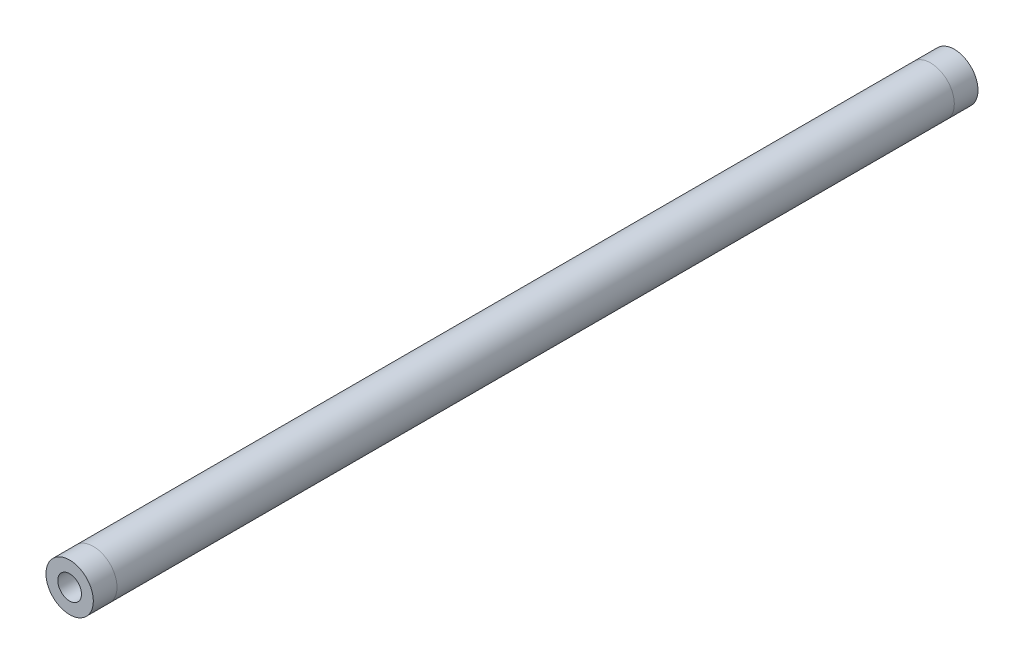
ISO-10303-21;
HEADER;
FILE_DESCRIPTION(('STEP AP214'),'2;1');
FILE_NAME('part.step','',(''),(''),'','','');
FILE_SCHEMA(('AUTOMOTIVE_DESIGN { 1 0 10303 214 1 1 1 1 }'));
ENDSEC;
DATA;
#1=APPLICATION_CONTEXT('core data for automotive mechanical design processes');
#2=APPLICATION_PROTOCOL_DEFINITION('international standard','automotive_design',2000,#1);
#3=PRODUCT_CONTEXT('',#1,'mechanical');
#4=PRODUCT('Part','Part','',(#3));
#5=PRODUCT_RELATED_PRODUCT_CATEGORY('part','',(#4));
#6=PRODUCT_DEFINITION_FORMATION('','',#4);
#7=PRODUCT_DEFINITION_CONTEXT('part definition',#1,'design');
#8=PRODUCT_DEFINITION('design','',#6,#7);
#9=PRODUCT_DEFINITION_SHAPE('','',#8);
#10=(LENGTH_UNIT() NAMED_UNIT(*) SI_UNIT(.MILLI.,.METRE.));
#11=(NAMED_UNIT(*) PLANE_ANGLE_UNIT() SI_UNIT($,.RADIAN.));
#12=(NAMED_UNIT(*) SI_UNIT($,.STERADIAN.) SOLID_ANGLE_UNIT());
#13=UNCERTAINTY_MEASURE_WITH_UNIT(LENGTH_MEASURE(1.E-05),#10,'distance_accuracy_value','');
#14=(GEOMETRIC_REPRESENTATION_CONTEXT(3) GLOBAL_UNCERTAINTY_ASSIGNED_CONTEXT((#13)) GLOBAL_UNIT_ASSIGNED_CONTEXT((#10,
#11,#12)) REPRESENTATION_CONTEXT('',''));
#15=CARTESIAN_POINT('',(0.,0.,0.));
#16=DIRECTION('',(0.,0.,1.));
#17=DIRECTION('',(1.,0.,0.));
#18=AXIS2_PLACEMENT_3D('',#15,#16,#17);
#19=CARTESIAN_POINT('',(0.,0.,-237.205621600147));
#20=DIRECTION('',(0.,0.,1.));
#21=DIRECTION('',(1.,0.,0.));
#22=AXIS2_PLACEMENT_3D('',#19,#20,#21);
#23=CYLINDRICAL_SURFACE('',#22,6.35);
#24=CARTESIAN_POINT('',(0.,0.,-237.205621600147));
#25=DIRECTION('',(0.,0.,1.));
#26=DIRECTION('',(1.,0.,0.));
#27=AXIS2_PLACEMENT_3D('',#24,#25,#26);
#28=CIRCLE('',#27,6.35);
#29=CARTESIAN_POINT('',(6.35,0.,-237.205621600147));
#30=VERTEX_POINT('',#29);
#31=EDGE_CURVE('E87',#30,#30,#28,.T.);
#32=ORIENTED_EDGE('',*,*,#31,.T.);
#33=EDGE_LOOP('',(#32));
#34=FACE_BOUND('',#33,.T.);
#35=CARTESIAN_POINT('',(0.,0.,-230.855621600147));
#36=DIRECTION('',(0.,0.,1.));
#37=DIRECTION('',(1.,0.,0.));
#38=AXIS2_PLACEMENT_3D('',#35,#36,#37);
#39=CIRCLE('',#38,6.35);
#40=CARTESIAN_POINT('',(6.35,0.,-230.855621600147));
#41=VERTEX_POINT('',#40);
#42=EDGE_CURVE('E83',#41,#41,#39,.T.);
#43=ORIENTED_EDGE('',*,*,#42,.F.);
#44=EDGE_LOOP('',(#43));
#45=FACE_BOUND('',#44,.T.);
#46=ADVANCED_FACE('F80',(#34,#45),#23,.T.);
#47=CARTESIAN_POINT('',(0.,0.,-237.205621600147));
#48=DIRECTION('',(0.,0.,1.));
#49=DIRECTION('',(1.,0.,0.));
#50=AXIS2_PLACEMENT_3D('',#47,#48,#49);
#51=PLANE('',#50);
#52=CARTESIAN_POINT('',(0.,0.,-237.205621600147));
#53=DIRECTION('',(0.,0.,1.));
#54=DIRECTION('',(1.,0.,0.));
#55=AXIS2_PLACEMENT_3D('',#52,#53,#54);
#56=CIRCLE('',#55,3.175);
#57=CARTESIAN_POINT('',(3.175,0.,-237.205621600147));
#58=VERTEX_POINT('',#57);
#59=EDGE_CURVE('E96',#58,#58,#56,.T.);
#60=ORIENTED_EDGE('',*,*,#59,.T.);
#61=EDGE_LOOP('',(#60));
#62=FACE_BOUND('',#61,.T.);
#63=ORIENTED_EDGE('',*,*,#31,.F.);
#64=EDGE_LOOP('',(#63));
#65=FACE_BOUND('',#64,.T.);
#66=ADVANCED_FACE('F123',(#62,#65),#51,.F.);
#67=CARTESIAN_POINT('',(0.,0.,-230.855621600147));
#68=DIRECTION('',(0.,0.,1.));
#69=DIRECTION('',(1.,0.,0.));
#70=AXIS2_PLACEMENT_3D('',#67,#68,#69);
#71=PLANE('',#70);
#72=CARTESIAN_POINT('',(0.,0.,-230.855621600147));
#73=DIRECTION('',(0.,0.,1.));
#74=DIRECTION('',(1.,0.,0.));
#75=AXIS2_PLACEMENT_3D('',#72,#73,#74);
#76=CIRCLE('',#75,4.8768);
#77=CARTESIAN_POINT('',(-4.8768,0.,-230.855621600147));
#78=VERTEX_POINT('',#77);
#79=EDGE_CURVE('E12',#78,#78,#76,.T.);
#80=ORIENTED_EDGE('',*,*,#79,.F.);
#81=EDGE_LOOP('',(#80));
#82=FACE_BOUND('',#81,.T.);
#83=ORIENTED_EDGE('',*,*,#42,.T.);
#84=EDGE_LOOP('',(#83));
#85=FACE_BOUND('',#84,.T.);
#86=ADVANCED_FACE('F119',(#82,#85),#71,.T.);
#87=CARTESIAN_POINT('',(0.,0.,-237.205621600147));
#88=DIRECTION('',(0.,0.,1.));
#89=DIRECTION('',(1.,0.,0.));
#90=AXIS2_PLACEMENT_3D('',#87,#88,#89);
#91=CYLINDRICAL_SURFACE('',#90,3.175);
#92=ORIENTED_EDGE('',*,*,#59,.F.);
#93=EDGE_LOOP('',(#92));
#94=FACE_BOUND('',#93,.T.);
#95=CARTESIAN_POINT('',(0.,0.,-221.330621600147));
#96=DIRECTION('',(0.,0.,1.));
#97=DIRECTION('',(1.,0.,0.));
#98=AXIS2_PLACEMENT_3D('',#95,#96,#97);
#99=CIRCLE('',#98,3.175);
#100=CARTESIAN_POINT('',(3.175,0.,-221.330621600147));
#101=VERTEX_POINT('',#100);
#102=EDGE_CURVE('E102',#101,#101,#99,.T.);
#103=ORIENTED_EDGE('',*,*,#102,.T.);
#104=EDGE_LOOP('',(#103));
#105=FACE_BOUND('',#104,.T.);
#106=ADVANCED_FACE('F108',(#94,#105),#91,.F.);
#107=CARTESIAN_POINT('',(0.,0.,-221.330621600147));
#108=DIRECTION('',(0.,0.,1.));
#109=DIRECTION('',(1.,0.,0.));
#110=AXIS2_PLACEMENT_3D('',#107,#108,#109);
#111=PLANE('',#110);
#112=CARTESIAN_POINT('',(0.,0.,-221.330621600147));
#113=DIRECTION('',(0.,0.,1.));
#114=DIRECTION('',(1.,0.,0.));
#115=AXIS2_PLACEMENT_3D('',#112,#113,#114);
#116=CIRCLE('',#115,4.8768);
#117=CARTESIAN_POINT('',(-4.8768,0.,-221.330621600147));
#118=VERTEX_POINT('',#117);
#119=EDGE_CURVE('E94',#118,#118,#116,.T.);
#120=ORIENTED_EDGE('',*,*,#119,.T.);
#121=EDGE_LOOP('',(#120));
#122=FACE_BOUND('',#121,.T.);
#123=ORIENTED_EDGE('',*,*,#102,.F.);
#124=EDGE_LOOP('',(#123));
#125=FACE_BOUND('',#124,.T.);
#126=ADVANCED_FACE('F110',(#122,#125),#111,.T.);
#127=CARTESIAN_POINT('',(0.,0.,-221.330621600147));
#128=DIRECTION('',(0.,0.,-1.));
#129=DIRECTION('',(-1.,0.,0.));
#130=AXIS2_PLACEMENT_3D('',#127,#128,#129);
#131=CYLINDRICAL_SURFACE('',#130,4.8768);
#132=CARTESIAN_POINT('',(-4.8768,0.,-221.330621600147));
#133=CARTESIAN_POINT('',(-4.8768,0.,-221.429840350147));
#134=CARTESIAN_POINT('',(-4.8768,0.,-221.529059100147));
#135=CARTESIAN_POINT('',(-4.8768,0.,-221.727496600147));
#136=CARTESIAN_POINT('',(-4.8768,0.,-221.826715350147));
#137=CARTESIAN_POINT('',(-4.8768,0.,-222.025152850147));
#138=CARTESIAN_POINT('',(-4.8768,0.,-222.124371600147));
#139=CARTESIAN_POINT('',(-4.8768,0.,-222.322809100147));
#140=CARTESIAN_POINT('',(-4.8768,0.,-222.422027850147));
#141=CARTESIAN_POINT('',(-4.8768,0.,-222.620465350147));
#142=CARTESIAN_POINT('',(-4.8768,0.,-222.719684100147));
#143=CARTESIAN_POINT('',(-4.8768,0.,-222.918121600147));
#144=CARTESIAN_POINT('',(-4.8768,0.,-223.017340350147));
#145=CARTESIAN_POINT('',(-4.8768,0.,-223.215777850147));
#146=CARTESIAN_POINT('',(-4.8768,0.,-223.314996600147));
#147=CARTESIAN_POINT('',(-4.8768,0.,-223.513434100147));
#148=CARTESIAN_POINT('',(-4.8768,0.,-223.612652850147));
#149=CARTESIAN_POINT('',(-4.8768,0.,-223.811090350147));
#150=CARTESIAN_POINT('',(-4.8768,0.,-223.910309100147));
#151=CARTESIAN_POINT('',(-4.8768,0.,-224.108746600147));
#152=CARTESIAN_POINT('',(-4.8768,0.,-224.207965350147));
#153=CARTESIAN_POINT('',(-4.8768,0.,-224.406402850147));
#154=CARTESIAN_POINT('',(-4.8768,0.,-224.505621600147));
#155=CARTESIAN_POINT('',(-4.8768,0.,-224.704059100147));
#156=CARTESIAN_POINT('',(-4.8768,0.,-224.803277850147));
#157=CARTESIAN_POINT('',(-4.8768,0.,-225.001715350147));
#158=CARTESIAN_POINT('',(-4.8768,0.,-225.100934100147));
#159=CARTESIAN_POINT('',(-4.8768,0.,-225.299371600147));
#160=CARTESIAN_POINT('',(-4.8768,0.,-225.398590350147));
#161=CARTESIAN_POINT('',(-4.8768,0.,-225.597027850147));
#162=CARTESIAN_POINT('',(-4.8768,0.,-225.696246600147));
#163=CARTESIAN_POINT('',(-4.8768,0.,-225.894684100147));
#164=CARTESIAN_POINT('',(-4.8768,0.,-225.993902850147));
#165=CARTESIAN_POINT('',(-4.8768,0.,-226.192340350147));
#166=CARTESIAN_POINT('',(-4.8768,0.,-226.291559100147));
#167=CARTESIAN_POINT('',(-4.8768,0.,-226.489996600147));
#168=CARTESIAN_POINT('',(-4.8768,0.,-226.589215350147));
#169=CARTESIAN_POINT('',(-4.8768,0.,-226.787652850147));
#170=CARTESIAN_POINT('',(-4.8768,0.,-226.886871600147));
#171=CARTESIAN_POINT('',(-4.8768,0.,-227.085309100147));
#172=CARTESIAN_POINT('',(-4.8768,0.,-227.184527850147));
#173=CARTESIAN_POINT('',(-4.8768,0.,-227.382965350147));
#174=CARTESIAN_POINT('',(-4.8768,0.,-227.482184100147));
#175=CARTESIAN_POINT('',(-4.8768,0.,-227.680621600147));
#176=CARTESIAN_POINT('',(-4.8768,0.,-227.779840350147));
#177=CARTESIAN_POINT('',(-4.8768,0.,-227.978277850147));
#178=CARTESIAN_POINT('',(-4.8768,0.,-228.077496600147));
#179=CARTESIAN_POINT('',(-4.8768,0.,-228.275934100147));
#180=CARTESIAN_POINT('',(-4.8768,0.,-228.375152850147));
#181=CARTESIAN_POINT('',(-4.8768,0.,-228.573590350147));
#182=CARTESIAN_POINT('',(-4.8768,0.,-228.672809100147));
#183=CARTESIAN_POINT('',(-4.8768,0.,-228.871246600147));
#184=CARTESIAN_POINT('',(-4.8768,0.,-228.970465350147));
#185=CARTESIAN_POINT('',(-4.8768,0.,-229.168902850147));
#186=CARTESIAN_POINT('',(-4.8768,0.,-229.268121600147));
#187=CARTESIAN_POINT('',(-4.8768,0.,-229.466559100147));
#188=CARTESIAN_POINT('',(-4.8768,0.,-229.565777850147));
#189=CARTESIAN_POINT('',(-4.8768,0.,-229.764215350147));
#190=CARTESIAN_POINT('',(-4.8768,0.,-229.863434100147));
#191=CARTESIAN_POINT('',(-4.8768,0.,-230.061871600147));
#192=CARTESIAN_POINT('',(-4.8768,0.,-230.161090350147));
#193=CARTESIAN_POINT('',(-4.8768,0.,-230.359527850147));
#194=CARTESIAN_POINT('',(-4.8768,0.,-230.458746600147));
#195=CARTESIAN_POINT('',(-4.8768,0.,-230.657184100147));
#196=CARTESIAN_POINT('',(-4.8768,0.,-230.756402850147));
#197=CARTESIAN_POINT('',(-4.8768,0.,-230.855621600147));
#198=B_SPLINE_CURVE_WITH_KNOTS('',3,(#132,#133,#134,#135,#136,#137,#138,#139,#140,#141,#142,
#143,#144,#145,#146,#147,#148,#149,#150,#151,#152,#153,#154,#155,#156,#157,#158,#159,#160,#161,
#162,#163,#164,#165,#166,#167,#168,#169,#170,#171,#172,#173,#174,#175,#176,#177,#178,#179,#180,
#181,#182,#183,#184,#185,#186,#187,#188,#189,#190,#191,#192,#193,#194,#195,#196,#197),
.UNSPECIFIED.,.F.,.F.,(4,2,2,2,2,2,2,2,2,2,2,2,2,2,2,2,2,2,2,2,2,2,2,2,2,2,2,2,2,2,2,2,4),(0.,
0.29765625,0.5953125,0.892968750000001,1.190625,1.48828125,1.7859375,2.08359375,2.38125,
2.67890625,2.9765625,3.27421875,3.571875,3.86953125,4.1671875,4.46484375,4.7625,5.06015625,
5.3578125,5.65546875,5.953125,6.25078125,6.5484375,6.84609375,7.14375,7.44140625,7.7390625,
8.03671875000001,8.334375,8.63203125,8.92968750000001,9.22734375000001,9.52500000000001),.UNSPECIFIED.);
#199=EDGE_CURVE('BSEAM112',#118,#78,#198,.T.);
#200=ORIENTED_EDGE('',*,*,#119,.F.);
#201=ORIENTED_EDGE('',*,*,#79,.T.);
#202=ORIENTED_EDGE('',*,*,#199,.T.);
#203=ORIENTED_EDGE('',*,*,#199,.F.);
#204=EDGE_LOOP('',(#200,#202,#201,#203));
#205=FACE_BOUND('',#204,.T.);
#206=ADVANCED_FACE('F112',(#205),#131,.T.);
#207=CLOSED_SHELL('',(#46,#66,#86,#106,#126,#206));
#208=MANIFOLD_SOLID_BREP('B2',#207);
#209=CARTESIAN_POINT('',(0.,0.,-230.855621600147));
#210=DIRECTION('',(0.,0.,1.));
#211=DIRECTION('',(1.,0.,0.));
#212=AXIS2_PLACEMENT_3D('',#209,#210,#211);
#213=CYLINDRICAL_SURFACE('',#212,6.35);
#214=CARTESIAN_POINT('',(0.,0.,-230.855621600147));
#215=DIRECTION('',(0.,0.,1.));
#216=DIRECTION('',(1.,0.,0.));
#217=AXIS2_PLACEMENT_3D('',#214,#215,#216);
#218=CIRCLE('',#217,6.35);
#219=CARTESIAN_POINT('',(6.35,0.,-230.855621600147));
#220=VERTEX_POINT('',#219);
#221=EDGE_CURVE('E79',#220,#220,#218,.T.);
#222=ORIENTED_EDGE('',*,*,#221,.T.);
#223=EDGE_LOOP('',(#222));
#224=FACE_BOUND('',#223,.T.);
#225=CARTESIAN_POINT('',(0.,0.,-6.35));
#226=DIRECTION('',(0.,0.,1.));
#227=DIRECTION('',(1.,0.,0.));
#228=AXIS2_PLACEMENT_3D('',#225,#226,#227);
#229=CIRCLE('',#228,6.35);
#230=CARTESIAN_POINT('',(6.35,0.,-6.35));
#231=VERTEX_POINT('',#230);
#232=EDGE_CURVE('E195',#231,#231,#229,.T.);
#233=ORIENTED_EDGE('',*,*,#232,.F.);
#234=EDGE_LOOP('',(#233));
#235=FACE_BOUND('',#234,.T.);
#236=ADVANCED_FACE('F192',(#224,#235),#213,.T.);
#237=CARTESIAN_POINT('',(0.,0.,-230.855621600147));
#238=DIRECTION('',(0.,0.,1.));
#239=DIRECTION('',(1.,0.,0.));
#240=AXIS2_PLACEMENT_3D('',#237,#238,#239);
#241=PLANE('',#240);
#242=CARTESIAN_POINT('',(0.,0.,-230.855621600147));
#243=DIRECTION('',(0.,0.,1.));
#244=DIRECTION('',(1.,0.,0.));
#245=AXIS2_PLACEMENT_3D('',#242,#243,#244);
#246=CIRCLE('',#245,4.8768);
#247=CARTESIAN_POINT('',(4.8768,0.,-230.855621600147));
#248=VERTEX_POINT('',#247);
#249=EDGE_CURVE('E204',#248,#248,#246,.T.);
#250=ORIENTED_EDGE('',*,*,#249,.T.);
#251=EDGE_LOOP('',(#250));
#252=FACE_BOUND('',#251,.T.);
#253=ORIENTED_EDGE('',*,*,#221,.F.);
#254=EDGE_LOOP('',(#253));
#255=FACE_BOUND('',#254,.T.);
#256=ADVANCED_FACE('F214',(#252,#255),#241,.F.);
#257=CARTESIAN_POINT('',(0.,0.,-6.35));
#258=DIRECTION('',(0.,0.,1.));
#259=DIRECTION('',(1.,0.,0.));
#260=AXIS2_PLACEMENT_3D('',#257,#258,#259);
#261=PLANE('',#260);
#262=CARTESIAN_POINT('',(0.,0.,-6.35));
#263=DIRECTION('',(0.,0.,1.));
#264=DIRECTION('',(1.,0.,0.));
#265=AXIS2_PLACEMENT_3D('',#262,#263,#264);
#266=CIRCLE('',#265,4.8768);
#267=CARTESIAN_POINT('',(4.8768,0.,-6.35));
#268=VERTEX_POINT('',#267);
#269=EDGE_CURVE('E206',#268,#268,#266,.T.);
#270=ORIENTED_EDGE('',*,*,#269,.F.);
#271=EDGE_LOOP('',(#270));
#272=FACE_BOUND('',#271,.T.);
#273=ORIENTED_EDGE('',*,*,#232,.T.);
#274=EDGE_LOOP('',(#273));
#275=FACE_BOUND('',#274,.T.);
#276=ADVANCED_FACE('F220',(#272,#275),#261,.T.);
#277=CARTESIAN_POINT('',(0.,0.,-230.855621600147));
#278=DIRECTION('',(0.,0.,1.));
#279=DIRECTION('',(1.,0.,0.));
#280=AXIS2_PLACEMENT_3D('',#277,#278,#279);
#281=CYLINDRICAL_SURFACE('',#280,4.8768);
#282=ORIENTED_EDGE('',*,*,#249,.F.);
#283=EDGE_LOOP('',(#282));
#284=FACE_BOUND('',#283,.T.);
#285=ORIENTED_EDGE('',*,*,#269,.T.);
#286=EDGE_LOOP('',(#285));
#287=FACE_BOUND('',#286,.T.);
#288=ADVANCED_FACE('F217',(#284,#287),#281,.F.);
#289=CLOSED_SHELL('',(#236,#256,#276,#288));
#290=MANIFOLD_SOLID_BREP('B7',#289);
#291=CARTESIAN_POINT('',(0.,0.,-6.35));
#292=DIRECTION('',(0.,0.,1.));
#293=DIRECTION('',(1.,0.,0.));
#294=AXIS2_PLACEMENT_3D('',#291,#292,#293);
#295=CYLINDRICAL_SURFACE('',#294,6.35);
#296=CARTESIAN_POINT('',(0.,0.,-6.35));
#297=DIRECTION('',(0.,0.,1.));
#298=DIRECTION('',(1.,0.,0.));
#299=AXIS2_PLACEMENT_3D('',#296,#297,#298);
#300=CIRCLE('',#299,6.35);
#301=CARTESIAN_POINT('',(6.35,0.,-6.35));
#302=VERTEX_POINT('',#301);
#303=EDGE_CURVE('E191',#302,#302,#300,.T.);
#304=ORIENTED_EDGE('',*,*,#303,.T.);
#305=EDGE_LOOP('',(#304));
#306=FACE_BOUND('',#305,.T.);
#307=CARTESIAN_POINT('',(0.,0.,0.));
#308=DIRECTION('',(0.,0.,1.));
#309=DIRECTION('',(1.,0.,0.));
#310=AXIS2_PLACEMENT_3D('',#307,#308,#309);
#311=CIRCLE('',#310,6.35);
#312=CARTESIAN_POINT('',(6.35,0.,0.));
#313=VERTEX_POINT('',#312);
#314=EDGE_CURVE('E269',#313,#313,#311,.T.);
#315=ORIENTED_EDGE('',*,*,#314,.F.);
#316=EDGE_LOOP('',(#315));
#317=FACE_BOUND('',#316,.T.);
#318=ADVANCED_FACE('F258',(#306,#317),#295,.T.);
#319=CARTESIAN_POINT('',(0.,0.,-6.35));
#320=DIRECTION('',(0.,0.,1.));
#321=DIRECTION('',(1.,0.,0.));
#322=AXIS2_PLACEMENT_3D('',#319,#320,#321);
#323=CYLINDRICAL_SURFACE('',#322,3.175);
#324=CARTESIAN_POINT('',(0.,0.,0.));
#325=DIRECTION('',(0.,0.,1.));
#326=DIRECTION('',(1.,0.,0.));
#327=AXIS2_PLACEMENT_3D('',#324,#325,#326);
#328=CIRCLE('',#327,3.175);
#329=CARTESIAN_POINT('',(3.175,0.,0.));
#330=VERTEX_POINT('',#329);
#331=EDGE_CURVE('E261',#330,#330,#328,.T.);
#332=ORIENTED_EDGE('',*,*,#331,.T.);
#333=EDGE_LOOP('',(#332));
#334=FACE_BOUND('',#333,.T.);
#335=CARTESIAN_POINT('',(0.,0.,-15.875));
#336=DIRECTION('',(0.,0.,1.));
#337=DIRECTION('',(1.,0.,0.));
#338=AXIS2_PLACEMENT_3D('',#335,#336,#337);
#339=CIRCLE('',#338,3.175);
#340=CARTESIAN_POINT('',(3.175,0.,-15.875));
#341=VERTEX_POINT('',#340);
#342=EDGE_CURVE('E281',#341,#341,#339,.T.);
#343=ORIENTED_EDGE('',*,*,#342,.F.);
#344=EDGE_LOOP('',(#343));
#345=FACE_BOUND('',#344,.T.);
#346=ADVANCED_FACE('F289',(#334,#345),#323,.F.);
#347=CARTESIAN_POINT('',(0.,0.,-6.35));
#348=DIRECTION('',(0.,0.,1.));
#349=DIRECTION('',(1.,0.,0.));
#350=AXIS2_PLACEMENT_3D('',#347,#348,#349);
#351=PLANE('',#350);
#352=CARTESIAN_POINT('',(0.,0.,-6.35));
#353=DIRECTION('',(0.,0.,1.));
#354=DIRECTION('',(1.,0.,0.));
#355=AXIS2_PLACEMENT_3D('',#352,#353,#354);
#356=CIRCLE('',#355,4.8768);
#357=CARTESIAN_POINT('',(4.8768,0.,-6.35));
#358=VERTEX_POINT('',#357);
#359=EDGE_CURVE('E271',#358,#358,#356,.T.);
#360=ORIENTED_EDGE('',*,*,#359,.T.);
#361=EDGE_LOOP('',(#360));
#362=FACE_BOUND('',#361,.T.);
#363=ORIENTED_EDGE('',*,*,#303,.F.);
#364=EDGE_LOOP('',(#363));
#365=FACE_BOUND('',#364,.T.);
#366=ADVANCED_FACE('F291',(#362,#365),#351,.F.);
#367=CARTESIAN_POINT('',(0.,0.,0.));
#368=DIRECTION('',(0.,0.,1.));
#369=DIRECTION('',(1.,0.,0.));
#370=AXIS2_PLACEMENT_3D('',#367,#368,#369);
#371=PLANE('',#370);
#372=ORIENTED_EDGE('',*,*,#314,.T.);
#373=EDGE_LOOP('',(#372));
#374=FACE_BOUND('',#373,.T.);
#375=ORIENTED_EDGE('',*,*,#331,.F.);
#376=EDGE_LOOP('',(#375));
#377=FACE_BOUND('',#376,.T.);
#378=ADVANCED_FACE('F297',(#374,#377),#371,.T.);
#379=CARTESIAN_POINT('',(0.,0.,-15.875));
#380=DIRECTION('',(0.,0.,1.));
#381=DIRECTION('',(1.,0.,0.));
#382=AXIS2_PLACEMENT_3D('',#379,#380,#381);
#383=CYLINDRICAL_SURFACE('',#382,4.8768);
#384=CARTESIAN_POINT('',(0.,0.,-15.875));
#385=DIRECTION('',(0.,0.,1.));
#386=DIRECTION('',(1.,0.,0.));
#387=AXIS2_PLACEMENT_3D('',#384,#385,#386);
#388=CIRCLE('',#387,4.8768);
#389=CARTESIAN_POINT('',(4.8768,0.,-15.875));
#390=VERTEX_POINT('',#389);
#391=EDGE_CURVE('E274',#390,#390,#388,.T.);
#392=CARTESIAN_POINT('',(4.8768,0.,-15.875));
#393=CARTESIAN_POINT('',(4.8768,0.,-15.77578125));
#394=CARTESIAN_POINT('',(4.8768,0.,-15.6765625));
#395=CARTESIAN_POINT('',(4.8768,0.,-15.478125));
#396=CARTESIAN_POINT('',(4.8768,0.,-15.37890625));
#397=CARTESIAN_POINT('',(4.8768,0.,-15.18046875));
#398=CARTESIAN_POINT('',(4.8768,0.,-15.08125));
#399=CARTESIAN_POINT('',(4.8768,0.,-14.8828125));
#400=CARTESIAN_POINT('',(4.8768,0.,-14.78359375));
#401=CARTESIAN_POINT('',(4.8768,0.,-14.58515625));
#402=CARTESIAN_POINT('',(4.8768,0.,-14.4859375));
#403=CARTESIAN_POINT('',(4.8768,0.,-14.2875));
#404=CARTESIAN_POINT('',(4.8768,0.,-14.18828125));
#405=CARTESIAN_POINT('',(4.8768,0.,-13.98984375));
#406=CARTESIAN_POINT('',(4.8768,0.,-13.890625));
#407=CARTESIAN_POINT('',(4.8768,0.,-13.6921875));
#408=CARTESIAN_POINT('',(4.8768,0.,-13.59296875));
#409=CARTESIAN_POINT('',(4.8768,0.,-13.39453125));
#410=CARTESIAN_POINT('',(4.8768,0.,-13.2953125));
#411=CARTESIAN_POINT('',(4.8768,0.,-13.096875));
#412=CARTESIAN_POINT('',(4.8768,0.,-12.99765625));
#413=CARTESIAN_POINT('',(4.8768,0.,-12.79921875));
#414=CARTESIAN_POINT('',(4.8768,0.,-12.7));
#415=CARTESIAN_POINT('',(4.8768,0.,-12.5015625));
#416=CARTESIAN_POINT('',(4.8768,0.,-12.40234375));
#417=CARTESIAN_POINT('',(4.8768,0.,-12.20390625));
#418=CARTESIAN_POINT('',(4.8768,0.,-12.1046875));
#419=CARTESIAN_POINT('',(4.8768,0.,-11.90625));
#420=CARTESIAN_POINT('',(4.8768,0.,-11.80703125));
#421=CARTESIAN_POINT('',(4.8768,0.,-11.60859375));
#422=CARTESIAN_POINT('',(4.8768,0.,-11.509375));
#423=CARTESIAN_POINT('',(4.8768,0.,-11.3109375));
#424=CARTESIAN_POINT('',(4.8768,0.,-11.21171875));
#425=CARTESIAN_POINT('',(4.8768,0.,-11.01328125));
#426=CARTESIAN_POINT('',(4.8768,0.,-10.9140625));
#427=CARTESIAN_POINT('',(4.8768,0.,-10.715625));
#428=CARTESIAN_POINT('',(4.8768,0.,-10.61640625));
#429=CARTESIAN_POINT('',(4.8768,0.,-10.41796875));
#430=CARTESIAN_POINT('',(4.8768,0.,-10.31875));
#431=CARTESIAN_POINT('',(4.8768,0.,-10.1203125));
#432=CARTESIAN_POINT('',(4.8768,0.,-10.02109375));
#433=CARTESIAN_POINT('',(4.8768,0.,-9.82265625));
#434=CARTESIAN_POINT('',(4.8768,0.,-9.7234375));
#435=CARTESIAN_POINT('',(4.8768,0.,-9.525));
#436=CARTESIAN_POINT('',(4.8768,0.,-9.42578125));
#437=CARTESIAN_POINT('',(4.8768,0.,-9.22734375));
#438=CARTESIAN_POINT('',(4.8768,0.,-9.128125));
#439=CARTESIAN_POINT('',(4.8768,0.,-8.9296875));
#440=CARTESIAN_POINT('',(4.8768,0.,-8.83046875));
#441=CARTESIAN_POINT('',(4.8768,0.,-8.63203125));
#442=CARTESIAN_POINT('',(4.8768,0.,-8.5328125));
#443=CARTESIAN_POINT('',(4.8768,0.,-8.334375));
#444=CARTESIAN_POINT('',(4.8768,0.,-8.23515625));
#445=CARTESIAN_POINT('',(4.8768,0.,-8.03671875));
#446=CARTESIAN_POINT('',(4.8768,0.,-7.9375));
#447=CARTESIAN_POINT('',(4.8768,0.,-7.7390625));
#448=CARTESIAN_POINT('',(4.8768,0.,-7.63984375));
#449=CARTESIAN_POINT('',(4.8768,0.,-7.44140625));
#450=CARTESIAN_POINT('',(4.8768,0.,-7.3421875));
#451=CARTESIAN_POINT('',(4.8768,0.,-7.14375));
#452=CARTESIAN_POINT('',(4.8768,0.,-7.04453125));
#453=CARTESIAN_POINT('',(4.8768,0.,-6.84609375));
#454=CARTESIAN_POINT('',(4.8768,0.,-6.746875));
#455=CARTESIAN_POINT('',(4.8768,0.,-6.5484375));
#456=CARTESIAN_POINT('',(4.8768,0.,-6.44921875));
#457=CARTESIAN_POINT('',(4.8768,0.,-6.35));
#458=B_SPLINE_CURVE_WITH_KNOTS('',3,(#392,#393,#394,#395,#396,#397,#398,#399,#400,#401,#402,
#403,#404,#405,#406,#407,#408,#409,#410,#411,#412,#413,#414,#415,#416,#417,#418,#419,#420,#421,
#422,#423,#424,#425,#426,#427,#428,#429,#430,#431,#432,#433,#434,#435,#436,#437,#438,#439,#440,
#441,#442,#443,#444,#445,#446,#447,#448,#449,#450,#451,#452,#453,#454,#455,#456,#457),
.UNSPECIFIED.,.F.,.F.,(4,2,2,2,2,2,2,2,2,2,2,2,2,2,2,2,2,2,2,2,2,2,2,2,2,2,2,2,2,2,2,2,4),(0.,
0.297656250000002,0.595312500000002,0.892968750000002,1.190625,1.48828125,1.7859375,2.08359375,
2.38125,2.67890625,2.9765625,3.27421875,3.571875,3.86953125,4.1671875,4.46484375,4.7625,
5.06015625,5.3578125,5.65546875,5.953125,6.25078125,6.5484375,6.84609375,7.14375,7.44140625,
7.7390625,8.03671875,8.334375,8.63203125,8.9296875,9.22734375,9.525),.UNSPECIFIED.);
#459=EDGE_CURVE('BSEAM302',#390,#358,#458,.T.);
#460=ORIENTED_EDGE('',*,*,#391,.T.);
#461=ORIENTED_EDGE('',*,*,#359,.F.);
#462=ORIENTED_EDGE('',*,*,#459,.T.);
#463=ORIENTED_EDGE('',*,*,#459,.F.);
#464=EDGE_LOOP('',(#460,#462,#461,#463));
#465=FACE_BOUND('',#464,.T.);
#466=ADVANCED_FACE('F302',(#465),#383,.T.);
#467=CARTESIAN_POINT('',(0.,0.,-15.875));
#468=DIRECTION('',(0.,0.,1.));
#469=DIRECTION('',(1.,0.,0.));
#470=AXIS2_PLACEMENT_3D('',#467,#468,#469);
#471=PLANE('',#470);
#472=ORIENTED_EDGE('',*,*,#342,.T.);
#473=EDGE_LOOP('',(#472));
#474=FACE_BOUND('',#473,.T.);
#475=ORIENTED_EDGE('',*,*,#391,.F.);
#476=EDGE_LOOP('',(#475));
#477=FACE_BOUND('',#476,.T.);
#478=ADVANCED_FACE('F286',(#474,#477),#471,.F.);
#479=CLOSED_SHELL('',(#318,#346,#366,#378,#466,#478));
#480=MANIFOLD_SOLID_BREP('B74',#479);
#481=ADVANCED_BREP_SHAPE_REPRESENTATION('',(#18,#208,#290,#480),#14);
#482=SHAPE_DEFINITION_REPRESENTATION(#9,#481);
ENDSEC;
END-ISO-10303-21;
